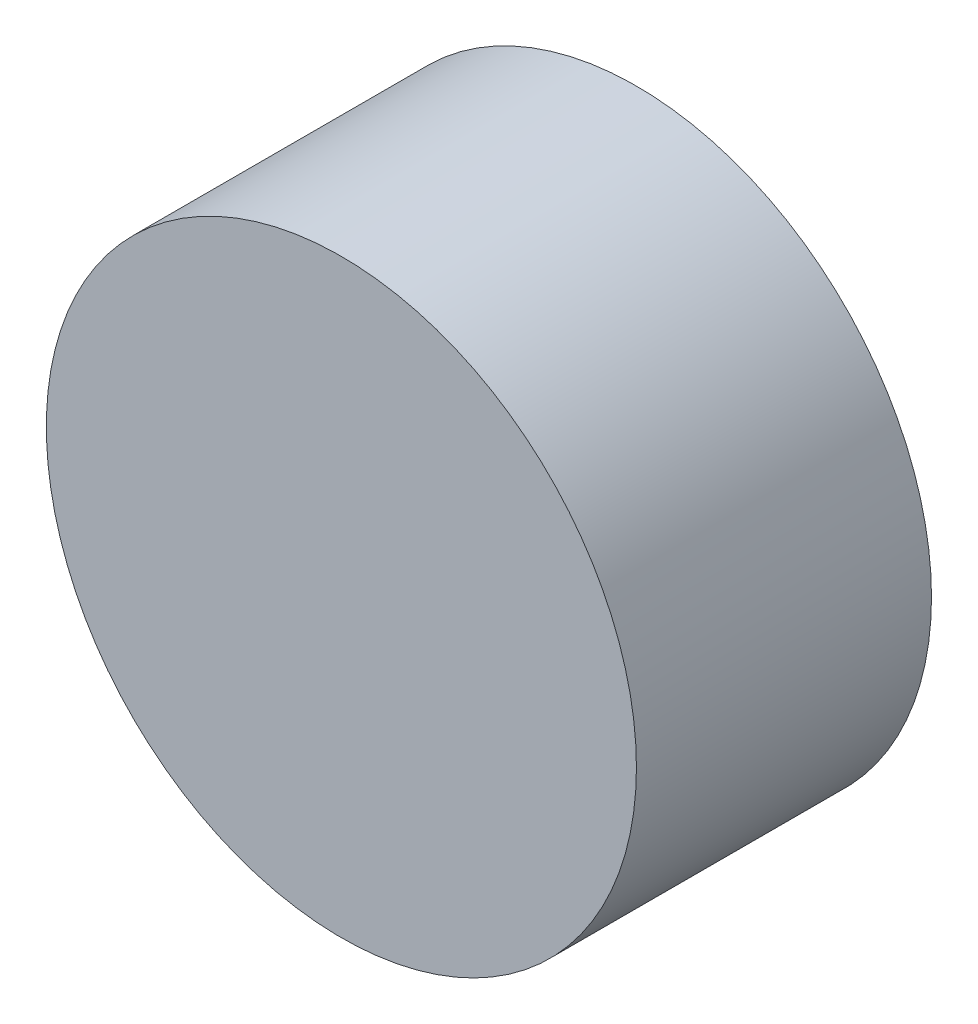
ISO-10303-21;
HEADER;
FILE_DESCRIPTION(('STEP AP214'),'2;1');
FILE_NAME('part.step','',(''),(''),'','','');
FILE_SCHEMA(('AUTOMOTIVE_DESIGN { 1 0 10303 214 1 1 1 1 }'));
ENDSEC;
DATA;
#1=APPLICATION_CONTEXT('core data for automotive mechanical design processes');
#2=APPLICATION_PROTOCOL_DEFINITION('international standard','automotive_design',2000,#1);
#3=PRODUCT_CONTEXT('',#1,'mechanical');
#4=PRODUCT('Part','Part','',(#3));
#5=PRODUCT_RELATED_PRODUCT_CATEGORY('part','',(#4));
#6=PRODUCT_DEFINITION_FORMATION('','',#4);
#7=PRODUCT_DEFINITION_CONTEXT('part definition',#1,'design');
#8=PRODUCT_DEFINITION('design','',#6,#7);
#9=PRODUCT_DEFINITION_SHAPE('','',#8);
#10=(LENGTH_UNIT() NAMED_UNIT(*) SI_UNIT(.MILLI.,.METRE.));
#11=(NAMED_UNIT(*) PLANE_ANGLE_UNIT() SI_UNIT($,.RADIAN.));
#12=(NAMED_UNIT(*) SI_UNIT($,.STERADIAN.) SOLID_ANGLE_UNIT());
#13=UNCERTAINTY_MEASURE_WITH_UNIT(LENGTH_MEASURE(1.E-05),#10,'distance_accuracy_value','');
#14=(GEOMETRIC_REPRESENTATION_CONTEXT(3) GLOBAL_UNCERTAINTY_ASSIGNED_CONTEXT((#13)) GLOBAL_UNIT_ASSIGNED_CONTEXT((#10,
#11,#12)) REPRESENTATION_CONTEXT('',''));
#15=CARTESIAN_POINT('',(0.,0.,0.));
#16=DIRECTION('',(0.,0.,1.));
#17=DIRECTION('',(1.,0.,0.));
#18=AXIS2_PLACEMENT_3D('',#15,#16,#17);
#19=CARTESIAN_POINT('',(0.,0.,100.));
#20=DIRECTION('',(0.,0.,-1.));
#21=DIRECTION('',(-1.,0.,0.));
#22=AXIS2_PLACEMENT_3D('',#19,#20,#21);
#23=CYLINDRICAL_SURFACE('',#22,100.);
#24=CARTESIAN_POINT('',(0.,0.,100.));
#25=DIRECTION('',(0.,0.,1.));
#26=DIRECTION('',(1.,0.,0.));
#27=AXIS2_PLACEMENT_3D('',#24,#25,#26);
#28=CIRCLE('',#27,100.);
#29=CARTESIAN_POINT('',(100.,0.,100.));
#30=VERTEX_POINT('',#29);
#31=EDGE_CURVE('E10',#30,#30,#28,.T.);
#32=ORIENTED_EDGE('',*,*,#31,.F.);
#33=EDGE_LOOP('',(#32));
#34=FACE_BOUND('',#33,.T.);
#35=CARTESIAN_POINT('',(0.,0.,0.));
#36=DIRECTION('',(0.,0.,1.));
#37=DIRECTION('',(1.,0.,0.));
#38=AXIS2_PLACEMENT_3D('',#35,#36,#37);
#39=CIRCLE('',#38,100.);
#40=CARTESIAN_POINT('',(100.,0.,0.));
#41=VERTEX_POINT('',#40);
#42=EDGE_CURVE('E40',#41,#41,#39,.T.);
#43=ORIENTED_EDGE('',*,*,#42,.T.);
#44=EDGE_LOOP('',(#43));
#45=FACE_BOUND('',#44,.T.);
#46=ADVANCED_FACE('F37',(#34,#45),#23,.T.);
#47=CARTESIAN_POINT('',(0.,0.,100.));
#48=DIRECTION('',(0.,0.,1.));
#49=DIRECTION('',(1.,0.,0.));
#50=AXIS2_PLACEMENT_3D('',#47,#48,#49);
#51=PLANE('',#50);
#52=ORIENTED_EDGE('',*,*,#31,.T.);
#53=EDGE_LOOP('',(#52));
#54=FACE_BOUND('',#53,.T.);
#55=ADVANCED_FACE('F52',(#54),#51,.T.);
#56=CARTESIAN_POINT('',(0.,0.,0.));
#57=DIRECTION('',(0.,0.,1.));
#58=DIRECTION('',(1.,0.,0.));
#59=AXIS2_PLACEMENT_3D('',#56,#57,#58);
#60=PLANE('',#59);
#61=ORIENTED_EDGE('',*,*,#42,.F.);
#62=EDGE_LOOP('',(#61));
#63=FACE_BOUND('',#62,.T.);
#64=ADVANCED_FACE('F50',(#63),#60,.F.);
#65=CLOSED_SHELL('',(#46,#55,#64));
#66=MANIFOLD_SOLID_BREP('B2',#65);
#67=ADVANCED_BREP_SHAPE_REPRESENTATION('',(#18,#66),#14);
#68=SHAPE_DEFINITION_REPRESENTATION(#9,#67);
ENDSEC;
END-ISO-10303-21;
